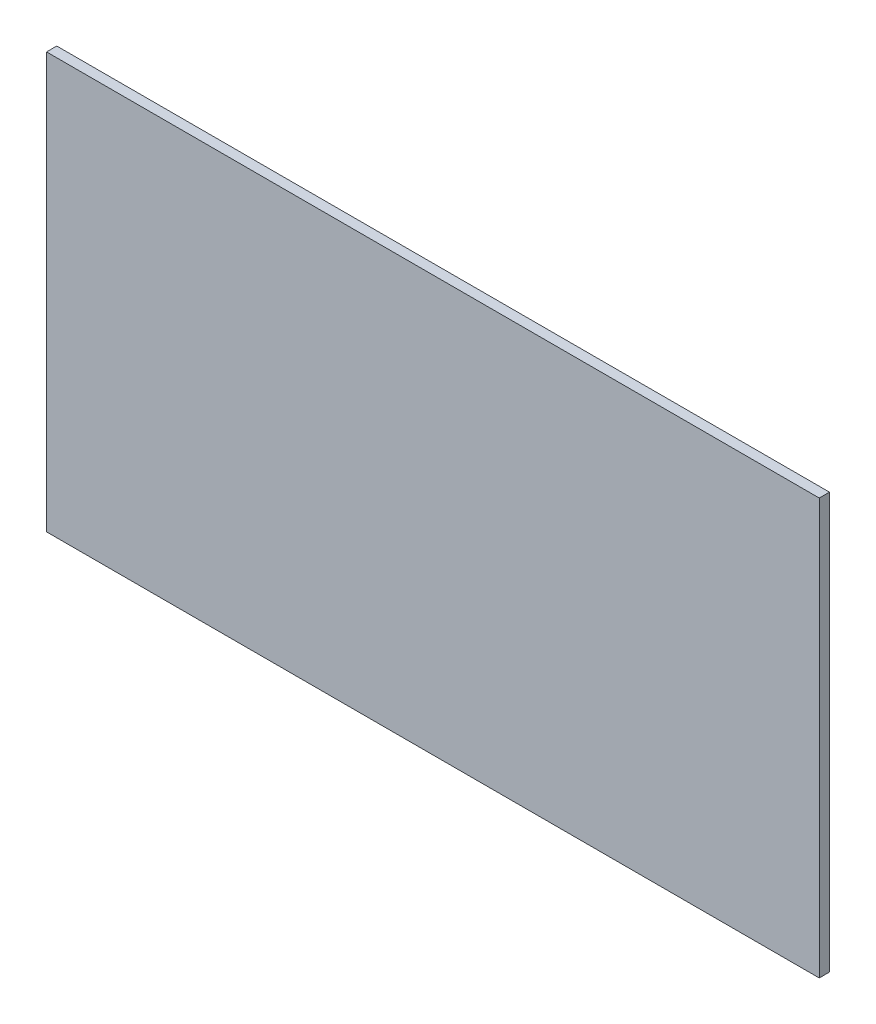
ISO-10303-21;
HEADER;
FILE_DESCRIPTION(('STEP AP214'),'2;1');
FILE_NAME('part.step','',(''),(''),'','','');
FILE_SCHEMA(('AUTOMOTIVE_DESIGN { 1 0 10303 214 1 1 1 1 }'));
ENDSEC;
DATA;
#1=APPLICATION_CONTEXT('core data for automotive mechanical design processes');
#2=APPLICATION_PROTOCOL_DEFINITION('international standard','automotive_design',2000,#1);
#3=PRODUCT_CONTEXT('',#1,'mechanical');
#4=PRODUCT('Part','Part','',(#3));
#5=PRODUCT_RELATED_PRODUCT_CATEGORY('part','',(#4));
#6=PRODUCT_DEFINITION_FORMATION('','',#4);
#7=PRODUCT_DEFINITION_CONTEXT('part definition',#1,'design');
#8=PRODUCT_DEFINITION('design','',#6,#7);
#9=PRODUCT_DEFINITION_SHAPE('','',#8);
#10=(LENGTH_UNIT() NAMED_UNIT(*) SI_UNIT(.MILLI.,.METRE.));
#11=(NAMED_UNIT(*) PLANE_ANGLE_UNIT() SI_UNIT($,.RADIAN.));
#12=(NAMED_UNIT(*) SI_UNIT($,.STERADIAN.) SOLID_ANGLE_UNIT());
#13=UNCERTAINTY_MEASURE_WITH_UNIT(LENGTH_MEASURE(1.E-05),#10,'distance_accuracy_value','');
#14=(GEOMETRIC_REPRESENTATION_CONTEXT(3) GLOBAL_UNCERTAINTY_ASSIGNED_CONTEXT((#13)) GLOBAL_UNIT_ASSIGNED_CONTEXT((#10,
#11,#12)) REPRESENTATION_CONTEXT('',''));
#15=CARTESIAN_POINT('',(0.,0.,0.));
#16=DIRECTION('',(0.,0.,1.));
#17=DIRECTION('',(1.,0.,0.));
#18=AXIS2_PLACEMENT_3D('',#15,#16,#17);
#19=CARTESIAN_POINT('',(151.5,-81.5,4.00000000000003));
#20=DIRECTION('',(-1.,0.,0.));
#21=DIRECTION('',(0.,0.,1.));
#22=AXIS2_PLACEMENT_3D('',#19,#20,#21);
#23=PLANE('',#22);
#24=DIRECTION('',(0.,1.,0.));
#25=VECTOR('',#24,1.);
#26=CARTESIAN_POINT('',(151.5,-81.5,0.));
#27=LINE('',#26,#25);
#28=CARTESIAN_POINT('',(151.5,-81.5,0.));
#29=VERTEX_POINT('',#28);
#30=CARTESIAN_POINT('',(151.5,81.5,8.60422844084496E-13));
#31=VERTEX_POINT('',#30);
#32=EDGE_CURVE('E114',#29,#31,#27,.T.);
#33=ORIENTED_EDGE('',*,*,#32,.T.);
#34=DIRECTION('',(0.,0.,-1.));
#35=VECTOR('',#34,1.);
#36=CARTESIAN_POINT('',(151.5,81.5,4.00000000000086));
#37=LINE('',#36,#35);
#38=CARTESIAN_POINT('',(151.5,81.5,4.00000000000086));
#39=VERTEX_POINT('',#38);
#40=EDGE_CURVE('E11',#39,#31,#37,.T.);
#41=ORIENTED_EDGE('',*,*,#40,.F.);
#42=DIRECTION('',(0.,1.,0.));
#43=VECTOR('',#42,1.);
#44=CARTESIAN_POINT('',(151.5,-81.5,4.00000000000003));
#45=LINE('',#44,#43);
#46=CARTESIAN_POINT('',(151.5,-81.5,4.00000000000003));
#47=VERTEX_POINT('',#46);
#48=EDGE_CURVE('E97',#47,#39,#45,.T.);
#49=ORIENTED_EDGE('',*,*,#48,.F.);
#50=DIRECTION('',(0.,0.,-1.));
#51=VECTOR('',#50,1.);
#52=CARTESIAN_POINT('',(151.5,-81.5,4.00000000000003));
#53=LINE('',#52,#51);
#54=EDGE_CURVE('E110',#47,#29,#53,.T.);
#55=ORIENTED_EDGE('',*,*,#54,.T.);
#56=EDGE_LOOP('',(#33,#41,#49,#55));
#57=FACE_BOUND('',#56,.T.);
#58=ADVANCED_FACE('F45',(#57),#23,.F.);
#59=CARTESIAN_POINT('',(-151.5,81.5,4.00000000000086));
#60=DIRECTION('',(0.,-1.,0.));
#61=DIRECTION('',(0.,0.,-1.));
#62=AXIS2_PLACEMENT_3D('',#59,#60,#61);
#63=PLANE('',#62);
#64=DIRECTION('',(-1.,0.,0.));
#65=VECTOR('',#64,1.);
#66=CARTESIAN_POINT('',(-151.5,81.5,8.60422844084496E-13));
#67=LINE('',#66,#65);
#68=CARTESIAN_POINT('',(-151.5,81.5,8.60422844084496E-13));
#69=VERTEX_POINT('',#68);
#70=EDGE_CURVE('E102',#31,#69,#67,.T.);
#71=ORIENTED_EDGE('',*,*,#70,.T.);
#72=DIRECTION('',(0.,0.,-1.));
#73=VECTOR('',#72,1.);
#74=CARTESIAN_POINT('',(-151.5,81.5,4.00000000000086));
#75=LINE('',#74,#73);
#76=CARTESIAN_POINT('',(-151.5,81.5,4.00000000000086));
#77=VERTEX_POINT('',#76);
#78=EDGE_CURVE('E54',#77,#69,#75,.T.);
#79=ORIENTED_EDGE('',*,*,#78,.F.);
#80=DIRECTION('',(-1.,0.,0.));
#81=VECTOR('',#80,1.);
#82=CARTESIAN_POINT('',(-151.5,81.5,4.00000000000086));
#83=LINE('',#82,#81);
#84=EDGE_CURVE('E92',#39,#77,#83,.T.);
#85=ORIENTED_EDGE('',*,*,#84,.F.);
#86=ORIENTED_EDGE('',*,*,#40,.T.);
#87=EDGE_LOOP('',(#71,#79,#85,#86));
#88=FACE_BOUND('',#87,.T.);
#89=ADVANCED_FACE('F101',(#88),#63,.F.);
#90=CARTESIAN_POINT('',(-151.5,-81.5,4.00000000000003));
#91=DIRECTION('',(1.,0.,0.));
#92=DIRECTION('',(0.,0.,-1.));
#93=AXIS2_PLACEMENT_3D('',#90,#91,#92);
#94=PLANE('',#93);
#95=DIRECTION('',(0.,-1.,0.));
#96=VECTOR('',#95,1.);
#97=CARTESIAN_POINT('',(-151.5,-81.5,0.));
#98=LINE('',#97,#96);
#99=CARTESIAN_POINT('',(-151.5,-81.5,0.));
#100=VERTEX_POINT('',#99);
#101=EDGE_CURVE('E79',#69,#100,#98,.T.);
#102=ORIENTED_EDGE('',*,*,#101,.T.);
#103=DIRECTION('',(0.,0.,-1.));
#104=VECTOR('',#103,1.);
#105=CARTESIAN_POINT('',(-151.5,-81.5,4.00000000000003));
#106=LINE('',#105,#104);
#107=CARTESIAN_POINT('',(-151.5,-81.5,4.00000000000003));
#108=VERTEX_POINT('',#107);
#109=EDGE_CURVE('E104',#108,#100,#106,.T.);
#110=ORIENTED_EDGE('',*,*,#109,.F.);
#111=DIRECTION('',(0.,-1.,0.));
#112=VECTOR('',#111,1.);
#113=CARTESIAN_POINT('',(-151.5,-81.5,4.00000000000003));
#114=LINE('',#113,#112);
#115=EDGE_CURVE('E95',#77,#108,#114,.T.);
#116=ORIENTED_EDGE('',*,*,#115,.F.);
#117=ORIENTED_EDGE('',*,*,#78,.T.);
#118=EDGE_LOOP('',(#102,#110,#116,#117));
#119=FACE_BOUND('',#118,.T.);
#120=ADVANCED_FACE('F105',(#119),#94,.F.);
#121=CARTESIAN_POINT('',(-151.5,-81.5,4.00000000000003));
#122=DIRECTION('',(0.,1.,0.));
#123=DIRECTION('',(0.,0.,1.));
#124=AXIS2_PLACEMENT_3D('',#121,#122,#123);
#125=PLANE('',#124);
#126=DIRECTION('',(1.,0.,0.));
#127=VECTOR('',#126,1.);
#128=CARTESIAN_POINT('',(-151.5,-81.5,0.));
#129=LINE('',#128,#127);
#130=EDGE_CURVE('E85',#100,#29,#129,.T.);
#131=ORIENTED_EDGE('',*,*,#130,.T.);
#132=ORIENTED_EDGE('',*,*,#54,.F.);
#133=DIRECTION('',(1.,0.,0.));
#134=VECTOR('',#133,1.);
#135=CARTESIAN_POINT('',(-151.5,-81.5,4.00000000000003));
#136=LINE('',#135,#134);
#137=EDGE_CURVE('E62',#108,#47,#136,.T.);
#138=ORIENTED_EDGE('',*,*,#137,.F.);
#139=ORIENTED_EDGE('',*,*,#109,.T.);
#140=EDGE_LOOP('',(#131,#132,#138,#139));
#141=FACE_BOUND('',#140,.T.);
#142=ADVANCED_FACE('F128',(#141),#125,.F.);
#143=CARTESIAN_POINT('',(0.,0.,4.));
#144=DIRECTION('',(0.,0.,-1.));
#145=DIRECTION('',(-1.,0.,0.));
#146=AXIS2_PLACEMENT_3D('',#143,#144,#145);
#147=PLANE('',#146);
#148=ORIENTED_EDGE('',*,*,#48,.T.);
#149=ORIENTED_EDGE('',*,*,#84,.T.);
#150=ORIENTED_EDGE('',*,*,#115,.T.);
#151=ORIENTED_EDGE('',*,*,#137,.T.);
#152=EDGE_LOOP('',(#148,#149,#150,#151));
#153=FACE_BOUND('',#152,.T.);
#154=ADVANCED_FACE('F93',(#153),#147,.F.);
#155=CARTESIAN_POINT('',(0.,0.,0.));
#156=DIRECTION('',(0.,0.,-1.));
#157=DIRECTION('',(-1.,0.,0.));
#158=AXIS2_PLACEMENT_3D('',#155,#156,#157);
#159=PLANE('',#158);
#160=ORIENTED_EDGE('',*,*,#32,.F.);
#161=ORIENTED_EDGE('',*,*,#130,.F.);
#162=ORIENTED_EDGE('',*,*,#101,.F.);
#163=ORIENTED_EDGE('',*,*,#70,.F.);
#164=EDGE_LOOP('',(#160,#161,#162,#163));
#165=FACE_BOUND('',#164,.T.);
#166=ADVANCED_FACE('F131',(#165),#159,.T.);
#167=CLOSED_SHELL('',(#58,#89,#120,#142,#154,#166));
#168=MANIFOLD_SOLID_BREP('B2',#167);
#169=ADVANCED_BREP_SHAPE_REPRESENTATION('',(#18,#168),#14);
#170=SHAPE_DEFINITION_REPRESENTATION(#9,#169);
ENDSEC;
END-ISO-10303-21;
